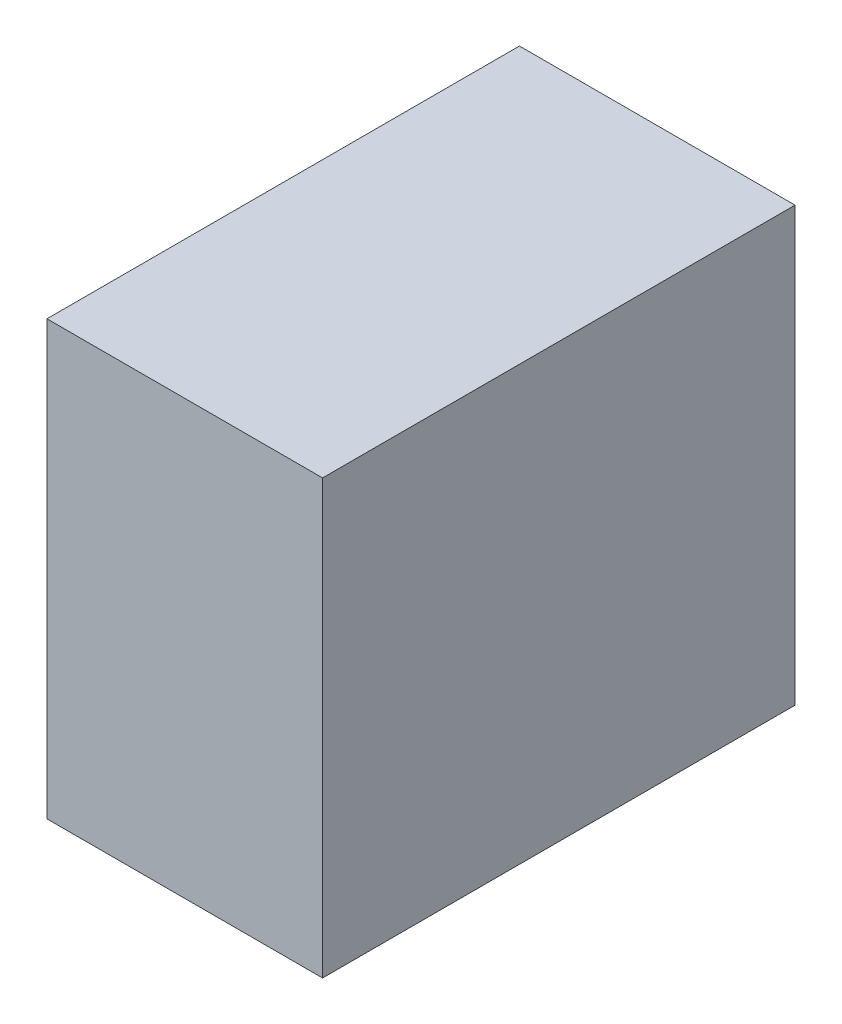
ISO-10303-21;
HEADER;
FILE_DESCRIPTION(('STEP AP214'),'2;1');
FILE_NAME('part.step','',(''),(''),'','','');
FILE_SCHEMA(('AUTOMOTIVE_DESIGN { 1 0 10303 214 1 1 1 1 }'));
ENDSEC;
DATA;
#1=APPLICATION_CONTEXT('core data for automotive mechanical design processes');
#2=APPLICATION_PROTOCOL_DEFINITION('international standard','automotive_design',2000,#1);
#3=PRODUCT_CONTEXT('',#1,'mechanical');
#4=PRODUCT('Part','Part','',(#3));
#5=PRODUCT_RELATED_PRODUCT_CATEGORY('part','',(#4));
#6=PRODUCT_DEFINITION_FORMATION('','',#4);
#7=PRODUCT_DEFINITION_CONTEXT('part definition',#1,'design');
#8=PRODUCT_DEFINITION('design','',#6,#7);
#9=PRODUCT_DEFINITION_SHAPE('','',#8);
#10=(LENGTH_UNIT() NAMED_UNIT(*) SI_UNIT(.MILLI.,.METRE.));
#11=(NAMED_UNIT(*) PLANE_ANGLE_UNIT() SI_UNIT($,.RADIAN.));
#12=(NAMED_UNIT(*) SI_UNIT($,.STERADIAN.) SOLID_ANGLE_UNIT());
#13=UNCERTAINTY_MEASURE_WITH_UNIT(LENGTH_MEASURE(1.E-05),#10,'distance_accuracy_value','');
#14=(GEOMETRIC_REPRESENTATION_CONTEXT(3) GLOBAL_UNCERTAINTY_ASSIGNED_CONTEXT((#13)) GLOBAL_UNIT_ASSIGNED_CONTEXT((#10,
#11,#12)) REPRESENTATION_CONTEXT('',''));
#15=CARTESIAN_POINT('',(0.,0.,0.));
#16=DIRECTION('',(0.,0.,1.));
#17=DIRECTION('',(1.,0.,0.));
#18=AXIS2_PLACEMENT_3D('',#15,#16,#17);
#19=CARTESIAN_POINT('',(-88.9,-139.7,304.8));
#20=DIRECTION('',(1.,0.,0.));
#21=DIRECTION('',(0.,0.,-1.));
#22=AXIS2_PLACEMENT_3D('',#19,#20,#21);
#23=PLANE('',#22);
#24=DIRECTION('',(0.,-1.,0.));
#25=VECTOR('',#24,1.);
#26=CARTESIAN_POINT('',(-88.9,-139.7,0.));
#27=LINE('',#26,#25);
#28=CARTESIAN_POINT('',(-88.9,139.7,0.));
#29=VERTEX_POINT('',#28);
#30=CARTESIAN_POINT('',(-88.9,-139.7,0.));
#31=VERTEX_POINT('',#30);
#32=EDGE_CURVE('E117',#29,#31,#27,.T.);
#33=ORIENTED_EDGE('',*,*,#32,.T.);
#34=DIRECTION('',(0.,0.,-1.));
#35=VECTOR('',#34,1.);
#36=CARTESIAN_POINT('',(-88.9,-139.7,304.8));
#37=LINE('',#36,#35);
#38=CARTESIAN_POINT('',(-88.9,-139.7,304.8));
#39=VERTEX_POINT('',#38);
#40=EDGE_CURVE('E11',#39,#31,#37,.T.);
#41=ORIENTED_EDGE('',*,*,#40,.F.);
#42=DIRECTION('',(0.,-1.,0.));
#43=VECTOR('',#42,1.);
#44=CARTESIAN_POINT('',(-88.9,-139.7,304.8));
#45=LINE('',#44,#43);
#46=CARTESIAN_POINT('',(-88.9,139.7,304.8));
#47=VERTEX_POINT('',#46);
#48=EDGE_CURVE('E101',#47,#39,#45,.T.);
#49=ORIENTED_EDGE('',*,*,#48,.F.);
#50=DIRECTION('',(0.,0.,-1.));
#51=VECTOR('',#50,1.);
#52=CARTESIAN_POINT('',(-88.9,139.7,304.8));
#53=LINE('',#52,#51);
#54=EDGE_CURVE('E113',#47,#29,#53,.T.);
#55=ORIENTED_EDGE('',*,*,#54,.T.);
#56=EDGE_LOOP('',(#33,#41,#49,#55));
#57=FACE_BOUND('',#56,.T.);
#58=ADVANCED_FACE('F49',(#57),#23,.F.);
#59=CARTESIAN_POINT('',(88.9,-139.7,304.8));
#60=DIRECTION('',(0.,1.,0.));
#61=DIRECTION('',(-1.,0.,0.));
#62=AXIS2_PLACEMENT_3D('',#59,#60,#61);
#63=PLANE('',#62);
#64=DIRECTION('',(1.,0.,0.));
#65=VECTOR('',#64,1.);
#66=CARTESIAN_POINT('',(88.9,-139.7,0.));
#67=LINE('',#66,#65);
#68=CARTESIAN_POINT('',(88.9,-139.7,0.));
#69=VERTEX_POINT('',#68);
#70=EDGE_CURVE('E106',#31,#69,#67,.T.);
#71=ORIENTED_EDGE('',*,*,#70,.T.);
#72=DIRECTION('',(0.,0.,-1.));
#73=VECTOR('',#72,1.);
#74=CARTESIAN_POINT('',(88.9,-139.7,304.8));
#75=LINE('',#74,#73);
#76=CARTESIAN_POINT('',(88.9,-139.7,304.8));
#77=VERTEX_POINT('',#76);
#78=EDGE_CURVE('E58',#77,#69,#75,.T.);
#79=ORIENTED_EDGE('',*,*,#78,.F.);
#80=DIRECTION('',(1.,0.,0.));
#81=VECTOR('',#80,1.);
#82=CARTESIAN_POINT('',(88.9,-139.7,304.8));
#83=LINE('',#82,#81);
#84=EDGE_CURVE('E96',#39,#77,#83,.T.);
#85=ORIENTED_EDGE('',*,*,#84,.F.);
#86=ORIENTED_EDGE('',*,*,#40,.T.);
#87=EDGE_LOOP('',(#71,#79,#85,#86));
#88=FACE_BOUND('',#87,.T.);
#89=ADVANCED_FACE('F105',(#88),#63,.F.);
#90=CARTESIAN_POINT('',(88.9,-139.7,304.8));
#91=DIRECTION('',(-1.,0.,0.));
#92=DIRECTION('',(0.,-1.,0.));
#93=AXIS2_PLACEMENT_3D('',#90,#91,#92);
#94=PLANE('',#93);
#95=DIRECTION('',(0.,1.,0.));
#96=VECTOR('',#95,1.);
#97=CARTESIAN_POINT('',(88.9,-139.7,0.));
#98=LINE('',#97,#96);
#99=CARTESIAN_POINT('',(88.9,139.7,0.));
#100=VERTEX_POINT('',#99);
#101=EDGE_CURVE('E83',#69,#100,#98,.T.);
#102=ORIENTED_EDGE('',*,*,#101,.T.);
#103=DIRECTION('',(0.,0.,-1.));
#104=VECTOR('',#103,1.);
#105=CARTESIAN_POINT('',(88.9,139.7,304.8));
#106=LINE('',#105,#104);
#107=CARTESIAN_POINT('',(88.9,139.7,304.8));
#108=VERTEX_POINT('',#107);
#109=EDGE_CURVE('E108',#108,#100,#106,.T.);
#110=ORIENTED_EDGE('',*,*,#109,.F.);
#111=DIRECTION('',(0.,1.,0.));
#112=VECTOR('',#111,1.);
#113=CARTESIAN_POINT('',(88.9,-139.7,304.8));
#114=LINE('',#113,#112);
#115=EDGE_CURVE('E99',#77,#108,#114,.T.);
#116=ORIENTED_EDGE('',*,*,#115,.F.);
#117=ORIENTED_EDGE('',*,*,#78,.T.);
#118=EDGE_LOOP('',(#102,#110,#116,#117));
#119=FACE_BOUND('',#118,.T.);
#120=ADVANCED_FACE('F109',(#119),#94,.F.);
#121=CARTESIAN_POINT('',(88.9,139.7,304.8));
#122=DIRECTION('',(0.,-1.,0.));
#123=DIRECTION('',(1.,0.,0.));
#124=AXIS2_PLACEMENT_3D('',#121,#122,#123);
#125=PLANE('',#124);
#126=DIRECTION('',(-1.,0.,0.));
#127=VECTOR('',#126,1.);
#128=CARTESIAN_POINT('',(88.9,139.7,0.));
#129=LINE('',#128,#127);
#130=EDGE_CURVE('E89',#100,#29,#129,.T.);
#131=ORIENTED_EDGE('',*,*,#130,.T.);
#132=ORIENTED_EDGE('',*,*,#54,.F.);
#133=DIRECTION('',(-1.,0.,0.));
#134=VECTOR('',#133,1.);
#135=CARTESIAN_POINT('',(88.9,139.7,304.8));
#136=LINE('',#135,#134);
#137=EDGE_CURVE('E66',#108,#47,#136,.T.);
#138=ORIENTED_EDGE('',*,*,#137,.F.);
#139=ORIENTED_EDGE('',*,*,#109,.T.);
#140=EDGE_LOOP('',(#131,#132,#138,#139));
#141=FACE_BOUND('',#140,.T.);
#142=ADVANCED_FACE('F130',(#141),#125,.F.);
#143=CARTESIAN_POINT('',(0.,0.,304.8));
#144=DIRECTION('',(0.,0.,1.));
#145=DIRECTION('',(1.,0.,0.));
#146=AXIS2_PLACEMENT_3D('',#143,#144,#145);
#147=PLANE('',#146);
#148=ORIENTED_EDGE('',*,*,#48,.T.);
#149=ORIENTED_EDGE('',*,*,#84,.T.);
#150=ORIENTED_EDGE('',*,*,#115,.T.);
#151=ORIENTED_EDGE('',*,*,#137,.T.);
#152=EDGE_LOOP('',(#148,#149,#150,#151));
#153=FACE_BOUND('',#152,.T.);
#154=ADVANCED_FACE('F97',(#153),#147,.T.);
#155=CARTESIAN_POINT('',(0.,0.,0.));
#156=DIRECTION('',(0.,0.,1.));
#157=DIRECTION('',(1.,0.,0.));
#158=AXIS2_PLACEMENT_3D('',#155,#156,#157);
#159=PLANE('',#158);
#160=ORIENTED_EDGE('',*,*,#32,.F.);
#161=ORIENTED_EDGE('',*,*,#130,.F.);
#162=ORIENTED_EDGE('',*,*,#101,.F.);
#163=ORIENTED_EDGE('',*,*,#70,.F.);
#164=EDGE_LOOP('',(#160,#161,#162,#163));
#165=FACE_BOUND('',#164,.T.);
#166=ADVANCED_FACE('F133',(#165),#159,.F.);
#167=CLOSED_SHELL('',(#58,#89,#120,#142,#154,#166));
#168=MANIFOLD_SOLID_BREP('B2',#167);
#169=ADVANCED_BREP_SHAPE_REPRESENTATION('',(#18,#168),#14);
#170=SHAPE_DEFINITION_REPRESENTATION(#9,#169);
ENDSEC;
END-ISO-10303-21;
